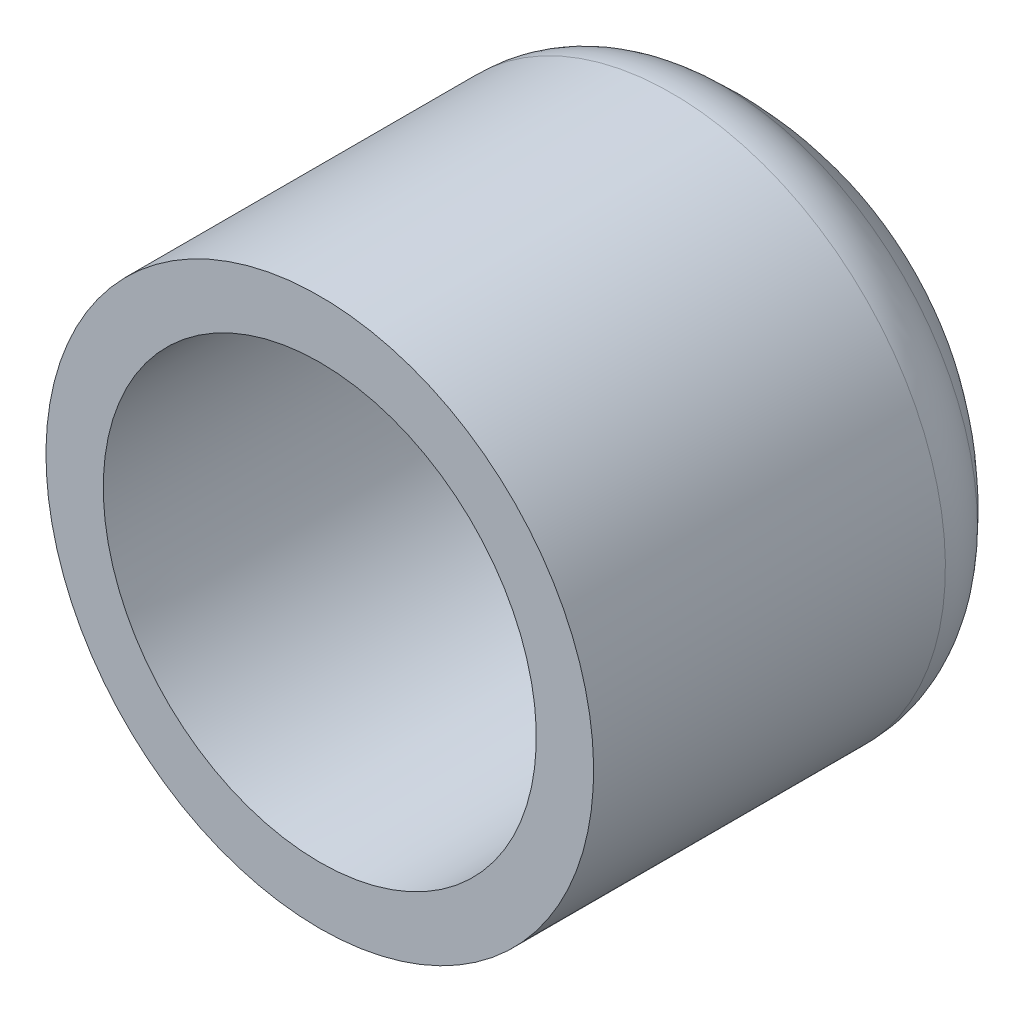
ISO-10303-21;
HEADER;
FILE_DESCRIPTION(('STEP AP214'),'2;1');
FILE_NAME('part.step','',(''),(''),'','','');
FILE_SCHEMA(('AUTOMOTIVE_DESIGN { 1 0 10303 214 1 1 1 1 }'));
ENDSEC;
DATA;
#1=APPLICATION_CONTEXT('core data for automotive mechanical design processes');
#2=APPLICATION_PROTOCOL_DEFINITION('international standard','automotive_design',2000,#1);
#3=PRODUCT_CONTEXT('',#1,'mechanical');
#4=PRODUCT('Part','Part','',(#3));
#5=PRODUCT_RELATED_PRODUCT_CATEGORY('part','',(#4));
#6=PRODUCT_DEFINITION_FORMATION('','',#4);
#7=PRODUCT_DEFINITION_CONTEXT('part definition',#1,'design');
#8=PRODUCT_DEFINITION('design','',#6,#7);
#9=PRODUCT_DEFINITION_SHAPE('','',#8);
#10=(LENGTH_UNIT() NAMED_UNIT(*) SI_UNIT(.MILLI.,.METRE.));
#11=(NAMED_UNIT(*) PLANE_ANGLE_UNIT() SI_UNIT($,.RADIAN.));
#12=(NAMED_UNIT(*) SI_UNIT($,.STERADIAN.) SOLID_ANGLE_UNIT());
#13=UNCERTAINTY_MEASURE_WITH_UNIT(LENGTH_MEASURE(1.E-05),#10,'distance_accuracy_value','');
#14=(GEOMETRIC_REPRESENTATION_CONTEXT(3) GLOBAL_UNCERTAINTY_ASSIGNED_CONTEXT((#13)) GLOBAL_UNIT_ASSIGNED_CONTEXT((#10,
#11,#12)) REPRESENTATION_CONTEXT('',''));
#15=CARTESIAN_POINT('',(0.,0.,0.));
#16=DIRECTION('',(0.,0.,1.));
#17=DIRECTION('',(1.,0.,0.));
#18=AXIS2_PLACEMENT_3D('',#15,#16,#17);
#19=CARTESIAN_POINT('',(0.,0.,-4.2799));
#20=DIRECTION('',(0.,0.,1.));
#21=DIRECTION('',(0.,-1.,0.));
#22=AXIS2_PLACEMENT_3D('',#19,#20,#21);
#23=CONICAL_SURFACE('',#22,13.2842,0.00749985937974601);
#24=CARTESIAN_POINT('',(0.,0.,16.0401));
#25=DIRECTION('',(0.,0.,1.));
#26=DIRECTION('',(0.,-1.,0.));
#27=AXIS2_PLACEMENT_3D('',#24,#25,#26);
#28=CIRCLE('',#27,13.4366);
#29=CARTESIAN_POINT('',(0.,-13.4366,16.0401));
#30=VERTEX_POINT('',#29);
#31=EDGE_CURVE('E43',#30,#30,#28,.T.);
#32=ORIENTED_EDGE('',*,*,#31,.T.);
#33=EDGE_LOOP('',(#32));
#34=FACE_BOUND('',#33,.T.);
#35=CARTESIAN_POINT('',(0.,0.,-4.2799));
#36=DIRECTION('',(0.,0.,1.));
#37=DIRECTION('',(0.,-1.,0.));
#38=AXIS2_PLACEMENT_3D('',#35,#36,#37);
#39=CIRCLE('',#38,13.2842);
#40=CARTESIAN_POINT('',(0.,-13.2842,-4.2799));
#41=VERTEX_POINT('',#40);
#42=EDGE_CURVE('E61',#41,#41,#39,.T.);
#43=ORIENTED_EDGE('',*,*,#42,.F.);
#44=EDGE_LOOP('',(#43));
#45=FACE_BOUND('',#44,.T.);
#46=ADVANCED_FACE('F32',(#34,#45),#23,.F.);
#47=CARTESIAN_POINT('',(0.,-13.4366,16.0401));
#48=DIRECTION('',(0.,0.,1.));
#49=DIRECTION('',(0.,-1.,0.));
#50=AXIS2_PLACEMENT_3D('',#47,#48,#49);
#51=PLANE('',#50);
#52=CARTESIAN_POINT('',(0.,0.,16.0401));
#53=DIRECTION('',(0.,0.,1.));
#54=DIRECTION('',(0.,-1.,0.));
#55=AXIS2_PLACEMENT_3D('',#52,#53,#54);
#56=CIRCLE('',#55,16.9926);
#57=CARTESIAN_POINT('',(0.,-16.9926,16.0401));
#58=VERTEX_POINT('',#57);
#59=EDGE_CURVE('E47',#58,#58,#56,.T.);
#60=ORIENTED_EDGE('',*,*,#59,.T.);
#61=EDGE_LOOP('',(#60));
#62=FACE_BOUND('',#61,.T.);
#63=ORIENTED_EDGE('',*,*,#31,.F.);
#64=EDGE_LOOP('',(#63));
#65=FACE_BOUND('',#64,.T.);
#66=ADVANCED_FACE('F69',(#62,#65),#51,.T.);
#67=CARTESIAN_POINT('',(0.,0.,16.0401));
#68=DIRECTION('',(0.,0.,1.));
#69=DIRECTION('',(0.,-1.,0.));
#70=AXIS2_PLACEMENT_3D('',#67,#68,#69);
#71=CYLINDRICAL_SURFACE('',#70,16.9926);
#72=CARTESIAN_POINT('',(0.,0.,-5.79016005507764));
#73=DIRECTION('',(0.,0.,1.));
#74=DIRECTION('',(0.,-1.,0.));
#75=AXIS2_PLACEMENT_3D('',#72,#73,#74);
#76=CIRCLE('',#75,16.9926);
#77=CARTESIAN_POINT('',(0.,-16.9926,-5.79016005507764));
#78=VERTEX_POINT('',#77);
#79=EDGE_CURVE('E39',#78,#78,#76,.T.);
#80=ORIENTED_EDGE('',*,*,#79,.T.);
#81=EDGE_LOOP('',(#80));
#82=FACE_BOUND('',#81,.T.);
#83=ORIENTED_EDGE('',*,*,#59,.F.);
#84=EDGE_LOOP('',(#83));
#85=FACE_BOUND('',#84,.T.);
#86=ADVANCED_FACE('F74',(#82,#85),#71,.T.);
#87=CARTESIAN_POINT('',(0.,0.,5.1435));
#88=DIRECTION('',(0.,0.,1.));
#89=DIRECTION('',(0.,-1.,0.));
#90=AXIS2_PLACEMENT_3D('',#87,#88,#89);
#91=SPHERICAL_SURFACE('',#90,21.1836);
#92=CARTESIAN_POINT('',(0.,0.,-9.01592932598563));
#93=DIRECTION('',(0.,0.,1.));
#94=DIRECTION('',(0.,-1.,0.));
#95=AXIS2_PLACEMENT_3D('',#92,#93,#94);
#96=CIRCLE('',#95,15.7561248447205);
#97=CARTESIAN_POINT('',(0.,-15.7561248447205,-9.01592932598563));
#98=VERTEX_POINT('',#97);
#99=EDGE_CURVE('E10',#98,#98,#96,.F.);
#100=ORIENTED_EDGE('',*,*,#99,.T.);
#101=EDGE_LOOP('',(#100));
#102=FACE_BOUND('',#101,.T.);
#103=ADVANCED_FACE('F80',(#102),#91,.T.);
#104=CARTESIAN_POINT('',(0.,0.,5.1435));
#105=DIRECTION('',(0.,0.,1.));
#106=DIRECTION('',(0.,-1.,0.));
#107=AXIS2_PLACEMENT_3D('',#104,#105,#106);
#108=SPHERICAL_SURFACE('',#107,17.1958);
#109=CARTESIAN_POINT('',(0.,0.,-7.97056154294397));
#110=DIRECTION('',(0.,0.,1.));
#111=DIRECTION('',(0.,-1.,0.));
#112=AXIS2_PLACEMENT_3D('',#109,#110,#111);
#113=CIRCLE('',#112,11.1228111324376);
#114=CARTESIAN_POINT('',(0.,-11.1228111324376,-7.97056154294397));
#115=VERTEX_POINT('',#114);
#116=EDGE_CURVE('E52',#115,#115,#113,.T.);
#117=ORIENTED_EDGE('',*,*,#116,.T.);
#118=EDGE_LOOP('',(#117));
#119=FACE_BOUND('',#118,.T.);
#120=ADVANCED_FACE('F83',(#119),#108,.F.);
#121=CARTESIAN_POINT('',(0.,0.,-4.94870984324048));
#122=DIRECTION('',(0.,0.,1.));
#123=DIRECTION('',(0.,-1.,0.));
#124=AXIS2_PLACEMENT_3D('',#121,#122,#123);
#125=TOROIDAL_SURFACE('',#124,8.5598,3.9624);
#126=CARTESIAN_POINT('',(0.,0.,-4.94870984324048));
#127=DIRECTION('',(0.,0.,1.));
#128=DIRECTION('',(0.,-1.,0.));
#129=AXIS2_PLACEMENT_3D('',#126,#127,#128);
#130=CIRCLE('',#129,12.5222);
#131=CARTESIAN_POINT('',(0.,-12.5222,-4.94870984324048));
#132=VERTEX_POINT('',#131);
#133=EDGE_CURVE('E55',#132,#132,#130,.T.);
#134=ORIENTED_EDGE('',*,*,#133,.T.);
#135=EDGE_LOOP('',(#134));
#136=FACE_BOUND('',#135,.T.);
#137=ORIENTED_EDGE('',*,*,#116,.F.);
#138=EDGE_LOOP('',(#137));
#139=FACE_BOUND('',#138,.T.);
#140=ADVANCED_FACE('F86',(#136,#139),#125,.F.);
#141=CARTESIAN_POINT('',(0.,0.,16.0401));
#142=DIRECTION('',(0.,0.,1.));
#143=DIRECTION('',(0.,-1.,0.));
#144=AXIS2_PLACEMENT_3D('',#141,#142,#143);
#145=CYLINDRICAL_SURFACE('',#144,12.5222);
#146=CARTESIAN_POINT('',(0.,0.,-4.2799));
#147=DIRECTION('',(0.,0.,1.));
#148=DIRECTION('',(0.,-1.,0.));
#149=AXIS2_PLACEMENT_3D('',#146,#147,#148);
#150=CIRCLE('',#149,12.5222);
#151=CARTESIAN_POINT('',(0.,-12.5222,-4.2799));
#152=VERTEX_POINT('',#151);
#153=EDGE_CURVE('E58',#152,#152,#150,.T.);
#154=ORIENTED_EDGE('',*,*,#153,.T.);
#155=EDGE_LOOP('',(#154));
#156=FACE_BOUND('',#155,.T.);
#157=ORIENTED_EDGE('',*,*,#133,.F.);
#158=EDGE_LOOP('',(#157));
#159=FACE_BOUND('',#158,.T.);
#160=ADVANCED_FACE('F90',(#156,#159),#145,.F.);
#161=CARTESIAN_POINT('',(0.,-13.2842,-4.2799));
#162=DIRECTION('',(0.,0.,1.));
#163=DIRECTION('',(0.,-1.,0.));
#164=AXIS2_PLACEMENT_3D('',#161,#162,#163);
#165=PLANE('',#164);
#166=ORIENTED_EDGE('',*,*,#42,.T.);
#167=EDGE_LOOP('',(#166));
#168=FACE_BOUND('',#167,.T.);
#169=ORIENTED_EDGE('',*,*,#153,.F.);
#170=EDGE_LOOP('',(#169));
#171=FACE_BOUND('',#170,.T.);
#172=ADVANCED_FACE('F65',(#168,#171),#165,.T.);
#173=CARTESIAN_POINT('',(0.,0.,-5.79016005507763));
#174=DIRECTION('',(0.,0.,1.));
#175=DIRECTION('',(0.,-1.,0.));
#176=AXIS2_PLACEMENT_3D('',#173,#174,#175);
#177=TOROIDAL_SURFACE('',#176,12.1666,4.826);
#178=ORIENTED_EDGE('',*,*,#99,.F.);
#179=EDGE_LOOP('',(#178));
#180=FACE_BOUND('',#179,.T.);
#181=ORIENTED_EDGE('',*,*,#79,.F.);
#182=EDGE_LOOP('',(#181));
#183=FACE_BOUND('',#182,.T.);
#184=ADVANCED_FACE('F34',(#180,#183),#177,.T.);
#185=CLOSED_SHELL('',(#46,#66,#86,#103,#120,#140,#160,#172,#184));
#186=MANIFOLD_SOLID_BREP('B2',#185);
#187=ADVANCED_BREP_SHAPE_REPRESENTATION('',(#18,#186),#14);
#188=SHAPE_DEFINITION_REPRESENTATION(#9,#187);
ENDSEC;
END-ISO-10303-21;
